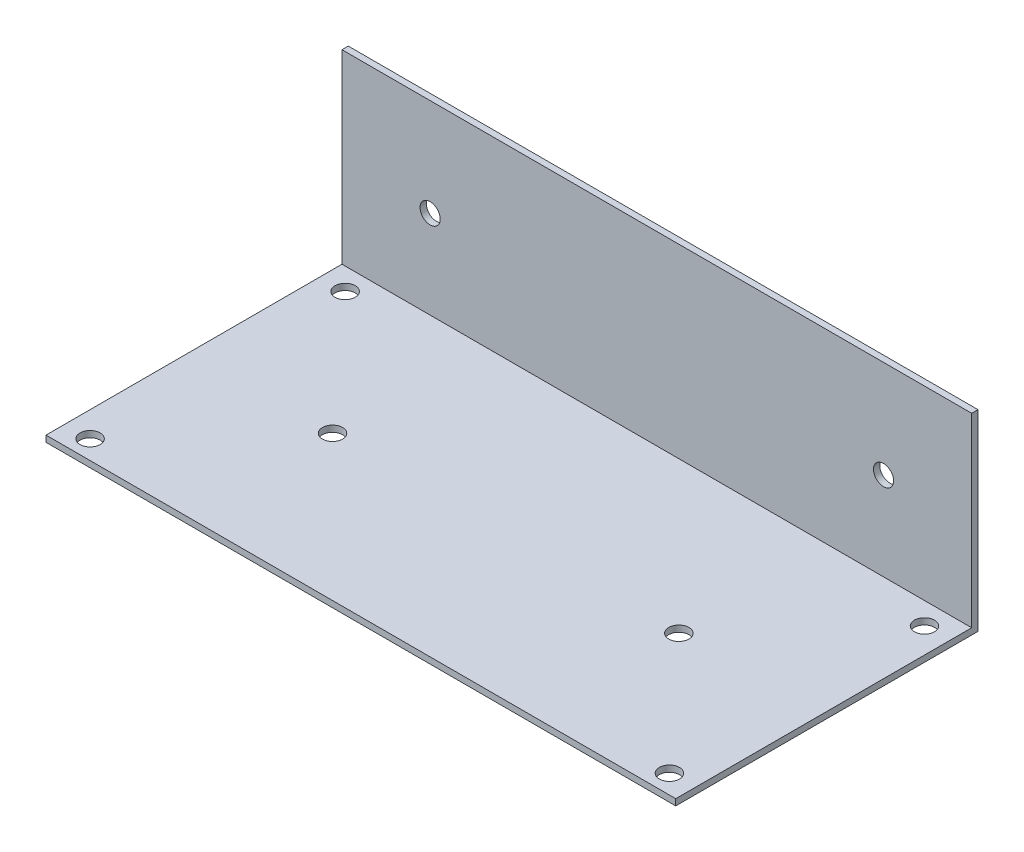
ISO-10303-21;
HEADER;
FILE_DESCRIPTION(('STEP AP214'),'2;1');
FILE_NAME('part.step','',(''),(''),'','','');
FILE_SCHEMA(('AUTOMOTIVE_DESIGN { 1 0 10303 214 1 1 1 1 }'));
ENDSEC;
DATA;
#1=APPLICATION_CONTEXT('core data for automotive mechanical design processes');
#2=APPLICATION_PROTOCOL_DEFINITION('international standard','automotive_design',2000,#1);
#3=PRODUCT_CONTEXT('',#1,'mechanical');
#4=PRODUCT('Part','Part','',(#3));
#5=PRODUCT_RELATED_PRODUCT_CATEGORY('part','',(#4));
#6=PRODUCT_DEFINITION_FORMATION('','',#4);
#7=PRODUCT_DEFINITION_CONTEXT('part definition',#1,'design');
#8=PRODUCT_DEFINITION('design','',#6,#7);
#9=PRODUCT_DEFINITION_SHAPE('','',#8);
#10=(LENGTH_UNIT() NAMED_UNIT(*) SI_UNIT(.MILLI.,.METRE.));
#11=(NAMED_UNIT(*) PLANE_ANGLE_UNIT() SI_UNIT($,.RADIAN.));
#12=(NAMED_UNIT(*) SI_UNIT($,.STERADIAN.) SOLID_ANGLE_UNIT());
#13=UNCERTAINTY_MEASURE_WITH_UNIT(LENGTH_MEASURE(1.E-05),#10,'distance_accuracy_value','');
#14=(GEOMETRIC_REPRESENTATION_CONTEXT(3) GLOBAL_UNCERTAINTY_ASSIGNED_CONTEXT((#13)) GLOBAL_UNIT_ASSIGNED_CONTEXT((#10,
#11,#12)) REPRESENTATION_CONTEXT('',''));
#15=CARTESIAN_POINT('',(0.,0.,0.));
#16=DIRECTION('',(0.,0.,1.));
#17=DIRECTION('',(1.,0.,0.));
#18=AXIS2_PLACEMENT_3D('',#15,#16,#17);
#19=CARTESIAN_POINT('',(100.,0.,0.));
#20=DIRECTION('',(0.,0.,1.));
#21=DIRECTION('',(1.,0.,0.));
#22=AXIS2_PLACEMENT_3D('',#19,#20,#21);
#23=PLANE('',#22);
#24=CARTESIAN_POINT('',(86.,15.,0.));
#25=DIRECTION('',(0.,0.,-1.));
#26=DIRECTION('',(-1.,0.,0.));
#27=AXIS2_PLACEMENT_3D('',#24,#25,#26);
#28=CIRCLE('',#27,1.6);
#29=CARTESIAN_POINT('',(84.4,15.,0.));
#30=VERTEX_POINT('',#29);
#31=EDGE_CURVE('E193',#30,#30,#28,.T.);
#32=ORIENTED_EDGE('',*,*,#31,.F.);
#33=EDGE_LOOP('',(#32));
#34=FACE_BOUND('',#33,.T.);
#35=CARTESIAN_POINT('',(14.,15.,0.));
#36=DIRECTION('',(0.,0.,-1.));
#37=DIRECTION('',(-1.,0.,0.));
#38=AXIS2_PLACEMENT_3D('',#35,#36,#37);
#39=CIRCLE('',#38,1.6);
#40=CARTESIAN_POINT('',(12.4,15.,0.));
#41=VERTEX_POINT('',#40);
#42=EDGE_CURVE('E196',#41,#41,#39,.T.);
#43=ORIENTED_EDGE('',*,*,#42,.F.);
#44=EDGE_LOOP('',(#43));
#45=FACE_BOUND('',#44,.T.);
#46=DIRECTION('',(0.,1.,0.));
#47=VECTOR('',#46,1.);
#48=CARTESIAN_POINT('',(0.,0.,0.));
#49=LINE('',#48,#47);
#50=CARTESIAN_POINT('',(0.,0.,0.));
#51=VERTEX_POINT('',#50);
#52=CARTESIAN_POINT('',(0.,30.5,0.));
#53=VERTEX_POINT('',#52);
#54=EDGE_CURVE('E133',#51,#53,#49,.T.);
#55=ORIENTED_EDGE('',*,*,#54,.T.);
#56=DIRECTION('',(-1.,0.,0.));
#57=VECTOR('',#56,1.);
#58=CARTESIAN_POINT('',(100.,30.5,0.));
#59=LINE('',#58,#57);
#60=CARTESIAN_POINT('',(100.,30.5,0.));
#61=VERTEX_POINT('',#60);
#62=EDGE_CURVE('E11',#61,#53,#59,.T.);
#63=ORIENTED_EDGE('',*,*,#62,.F.);
#64=DIRECTION('',(0.,1.,0.));
#65=VECTOR('',#64,1.);
#66=CARTESIAN_POINT('',(100.,0.,0.));
#67=LINE('',#66,#65);
#68=CARTESIAN_POINT('',(100.,0.,0.));
#69=VERTEX_POINT('',#68);
#70=EDGE_CURVE('E150',#69,#61,#67,.T.);
#71=ORIENTED_EDGE('',*,*,#70,.F.);
#72=DIRECTION('',(-1.,0.,0.));
#73=VECTOR('',#72,1.);
#74=CARTESIAN_POINT('',(100.,0.,0.));
#75=LINE('',#74,#73);
#76=EDGE_CURVE('E129',#69,#51,#75,.T.);
#77=ORIENTED_EDGE('',*,*,#76,.T.);
#78=EDGE_LOOP('',(#55,#63,#71,#77));
#79=FACE_BOUND('',#78,.T.);
#80=ADVANCED_FACE('F44',(#34,#45,#79),#23,.F.);
#81=CARTESIAN_POINT('',(100.,30.5,0.));
#82=DIRECTION('',(0.,-1.,0.));
#83=DIRECTION('',(0.,0.,-1.));
#84=AXIS2_PLACEMENT_3D('',#81,#82,#83);
#85=PLANE('',#84);
#86=DIRECTION('',(0.,0.,1.));
#87=VECTOR('',#86,1.);
#88=CARTESIAN_POINT('',(0.,30.5,0.));
#89=LINE('',#88,#87);
#90=CARTESIAN_POINT('',(0.,30.5,1.));
#91=VERTEX_POINT('',#90);
#92=EDGE_CURVE('E137',#53,#91,#89,.T.);
#93=ORIENTED_EDGE('',*,*,#92,.T.);
#94=DIRECTION('',(-1.,0.,0.));
#95=VECTOR('',#94,1.);
#96=CARTESIAN_POINT('',(100.,30.5,1.));
#97=LINE('',#96,#95);
#98=CARTESIAN_POINT('',(100.,30.5,1.));
#99=VERTEX_POINT('',#98);
#100=EDGE_CURVE('E53',#99,#91,#97,.T.);
#101=ORIENTED_EDGE('',*,*,#100,.F.);
#102=DIRECTION('',(0.,0.,1.));
#103=VECTOR('',#102,1.);
#104=CARTESIAN_POINT('',(100.,30.5,0.));
#105=LINE('',#104,#103);
#106=EDGE_CURVE('E98',#61,#99,#105,.T.);
#107=ORIENTED_EDGE('',*,*,#106,.F.);
#108=ORIENTED_EDGE('',*,*,#62,.T.);
#109=EDGE_LOOP('',(#93,#101,#107,#108));
#110=FACE_BOUND('',#109,.T.);
#111=ADVANCED_FACE('F183',(#110),#85,.F.);
#112=CARTESIAN_POINT('',(100.,30.5,1.));
#113=DIRECTION('',(0.,0.,-1.));
#114=DIRECTION('',(0.,1.,0.));
#115=AXIS2_PLACEMENT_3D('',#112,#113,#114);
#116=PLANE('',#115);
#117=CARTESIAN_POINT('',(86.,15.,0.999999999999997));
#118=DIRECTION('',(0.,0.,-1.));
#119=DIRECTION('',(0.,1.,0.));
#120=AXIS2_PLACEMENT_3D('',#117,#118,#119);
#121=CIRCLE('',#120,1.6);
#122=CARTESIAN_POINT('',(86.,16.6,0.999999999999997));
#123=VERTEX_POINT('',#122);
#124=EDGE_CURVE('E138',#123,#123,#121,.F.);
#125=ORIENTED_EDGE('',*,*,#124,.F.);
#126=EDGE_LOOP('',(#125));
#127=FACE_BOUND('',#126,.T.);
#128=CARTESIAN_POINT('',(14.,15.,0.999999999999997));
#129=DIRECTION('',(0.,0.,-1.));
#130=DIRECTION('',(0.,1.,0.));
#131=AXIS2_PLACEMENT_3D('',#128,#129,#130);
#132=CIRCLE('',#131,1.6);
#133=CARTESIAN_POINT('',(14.,16.6,0.999999999999997));
#134=VERTEX_POINT('',#133);
#135=EDGE_CURVE('E199',#134,#134,#132,.F.);
#136=ORIENTED_EDGE('',*,*,#135,.F.);
#137=EDGE_LOOP('',(#136));
#138=FACE_BOUND('',#137,.T.);
#139=DIRECTION('',(0.,-1.,0.));
#140=VECTOR('',#139,1.);
#141=CARTESIAN_POINT('',(0.,30.5,1.));
#142=LINE('',#141,#140);
#143=CARTESIAN_POINT('',(0.,0.999999999999994,0.999999999999994));
#144=VERTEX_POINT('',#143);
#145=EDGE_CURVE('E141',#91,#144,#142,.T.);
#146=ORIENTED_EDGE('',*,*,#145,.T.);
#147=DIRECTION('',(-1.,0.,0.));
#148=VECTOR('',#147,1.);
#149=CARTESIAN_POINT('',(100.,0.999999999999994,0.999999999999994));
#150=LINE('',#149,#148);
#151=CARTESIAN_POINT('',(100.,0.999999999999994,0.999999999999994));
#152=VERTEX_POINT('',#151);
#153=EDGE_CURVE('E122',#152,#144,#150,.T.);
#154=ORIENTED_EDGE('',*,*,#153,.F.);
#155=DIRECTION('',(0.,-1.,0.));
#156=VECTOR('',#155,1.);
#157=CARTESIAN_POINT('',(100.,30.5,1.));
#158=LINE('',#157,#156);
#159=EDGE_CURVE('E111',#99,#152,#158,.T.);
#160=ORIENTED_EDGE('',*,*,#159,.F.);
#161=ORIENTED_EDGE('',*,*,#100,.T.);
#162=EDGE_LOOP('',(#146,#154,#160,#161));
#163=FACE_BOUND('',#162,.T.);
#164=ADVANCED_FACE('F160',(#127,#138,#163),#116,.F.);
#165=CARTESIAN_POINT('',(100.,0.999999999999994,48.));
#166=DIRECTION('',(0.,-1.,0.));
#167=DIRECTION('',(0.,0.,-1.));
#168=AXIS2_PLACEMENT_3D('',#165,#166,#167);
#169=PLANE('',#168);
#170=CARTESIAN_POINT('',(4.00000000000042,0.999999999999994,4.5));
#171=DIRECTION('',(0.,-1.,0.));
#172=DIRECTION('',(0.,0.,-1.));
#173=AXIS2_PLACEMENT_3D('',#170,#171,#172);
#174=CIRCLE('',#173,1.6);
#175=CARTESIAN_POINT('',(4.00000000000042,0.999999999999994,2.9));
#176=VERTEX_POINT('',#175);
#177=EDGE_CURVE('E227',#176,#176,#174,.T.);
#178=ORIENTED_EDGE('',*,*,#177,.T.);
#179=EDGE_LOOP('',(#178));
#180=FACE_BOUND('',#179,.T.);
#181=CARTESIAN_POINT('',(96.0000000000004,0.999999999999994,4.5));
#182=DIRECTION('',(0.,-1.,0.));
#183=DIRECTION('',(0.,0.,-1.));
#184=AXIS2_PLACEMENT_3D('',#181,#182,#183);
#185=CIRCLE('',#184,1.60000000000001);
#186=CARTESIAN_POINT('',(96.0000000000004,0.999999999999994,2.89999999999999));
#187=VERTEX_POINT('',#186);
#188=EDGE_CURVE('E237',#187,#187,#185,.T.);
#189=ORIENTED_EDGE('',*,*,#188,.T.);
#190=EDGE_LOOP('',(#189));
#191=FACE_BOUND('',#190,.T.);
#192=CARTESIAN_POINT('',(96.,0.999999999999994,45.));
#193=DIRECTION('',(0.,-1.,0.));
#194=DIRECTION('',(0.,0.,-1.));
#195=AXIS2_PLACEMENT_3D('',#192,#193,#194);
#196=CIRCLE('',#195,1.60000000000001);
#197=CARTESIAN_POINT('',(96.,0.999999999999994,43.4));
#198=VERTEX_POINT('',#197);
#199=EDGE_CURVE('E241',#198,#198,#196,.T.);
#200=ORIENTED_EDGE('',*,*,#199,.T.);
#201=EDGE_LOOP('',(#200));
#202=FACE_BOUND('',#201,.T.);
#203=CARTESIAN_POINT('',(4.,0.999999999999994,45.));
#204=DIRECTION('',(0.,-1.,0.));
#205=DIRECTION('',(0.,0.,-1.));
#206=AXIS2_PLACEMENT_3D('',#203,#204,#205);
#207=CIRCLE('',#206,1.6);
#208=CARTESIAN_POINT('',(4.,0.999999999999994,43.4));
#209=VERTEX_POINT('',#208);
#210=EDGE_CURVE('E245',#209,#209,#207,.T.);
#211=ORIENTED_EDGE('',*,*,#210,.T.);
#212=EDGE_LOOP('',(#211));
#213=FACE_BOUND('',#212,.T.);
#214=CARTESIAN_POINT('',(22.5,0.999999999999994,25.));
#215=DIRECTION('',(0.,-1.,0.));
#216=DIRECTION('',(0.,0.,-1.));
#217=AXIS2_PLACEMENT_3D('',#214,#215,#216);
#218=CIRCLE('',#217,1.6);
#219=CARTESIAN_POINT('',(22.5,0.999999999999994,23.4));
#220=VERTEX_POINT('',#219);
#221=EDGE_CURVE('E205',#220,#220,#218,.F.);
#222=ORIENTED_EDGE('',*,*,#221,.F.);
#223=EDGE_LOOP('',(#222));
#224=FACE_BOUND('',#223,.T.);
#225=CARTESIAN_POINT('',(77.5,0.999999999999994,25.));
#226=DIRECTION('',(0.,-1.,0.));
#227=DIRECTION('',(0.,0.,-1.));
#228=AXIS2_PLACEMENT_3D('',#225,#226,#227);
#229=CIRCLE('',#228,1.6);
#230=CARTESIAN_POINT('',(77.5,0.999999999999994,23.4));
#231=VERTEX_POINT('',#230);
#232=EDGE_CURVE('E223',#231,#231,#229,.F.);
#233=ORIENTED_EDGE('',*,*,#232,.F.);
#234=EDGE_LOOP('',(#233));
#235=FACE_BOUND('',#234,.T.);
#236=DIRECTION('',(0.,0.,1.));
#237=VECTOR('',#236,1.);
#238=CARTESIAN_POINT('',(0.,0.999999999999994,48.));
#239=LINE('',#238,#237);
#240=CARTESIAN_POINT('',(0.,0.999999999999994,48.));
#241=VERTEX_POINT('',#240);
#242=EDGE_CURVE('E120',#144,#241,#239,.T.);
#243=ORIENTED_EDGE('',*,*,#242,.T.);
#244=DIRECTION('',(-1.,0.,0.));
#245=VECTOR('',#244,1.);
#246=CARTESIAN_POINT('',(100.,0.999999999999994,48.));
#247=LINE('',#246,#245);
#248=CARTESIAN_POINT('',(100.,0.999999999999994,48.));
#249=VERTEX_POINT('',#248);
#250=EDGE_CURVE('E117',#249,#241,#247,.T.);
#251=ORIENTED_EDGE('',*,*,#250,.F.);
#252=DIRECTION('',(0.,0.,1.));
#253=VECTOR('',#252,1.);
#254=CARTESIAN_POINT('',(100.,0.999999999999994,48.));
#255=LINE('',#254,#253);
#256=EDGE_CURVE('E105',#152,#249,#255,.T.);
#257=ORIENTED_EDGE('',*,*,#256,.F.);
#258=ORIENTED_EDGE('',*,*,#153,.T.);
#259=EDGE_LOOP('',(#243,#251,#257,#258));
#260=FACE_BOUND('',#259,.T.);
#261=ADVANCED_FACE('F118',(#180,#191,#202,#213,#224,#235,#260),#169,.F.);
#262=CARTESIAN_POINT('',(100.,0.,48.));
#263=DIRECTION('',(0.,0.,-1.));
#264=DIRECTION('',(0.,1.,0.));
#265=AXIS2_PLACEMENT_3D('',#262,#263,#264);
#266=PLANE('',#265);
#267=DIRECTION('',(0.,-1.,0.));
#268=VECTOR('',#267,1.);
#269=CARTESIAN_POINT('',(0.,0.,48.));
#270=LINE('',#269,#268);
#271=CARTESIAN_POINT('',(0.,0.,48.));
#272=VERTEX_POINT('',#271);
#273=EDGE_CURVE('E84',#241,#272,#270,.T.);
#274=ORIENTED_EDGE('',*,*,#273,.T.);
#275=DIRECTION('',(-1.,0.,0.));
#276=VECTOR('',#275,1.);
#277=CARTESIAN_POINT('',(100.,0.,48.));
#278=LINE('',#277,#276);
#279=CARTESIAN_POINT('',(100.,0.,48.));
#280=VERTEX_POINT('',#279);
#281=EDGE_CURVE('E123',#280,#272,#278,.T.);
#282=ORIENTED_EDGE('',*,*,#281,.F.);
#283=DIRECTION('',(0.,-1.,0.));
#284=VECTOR('',#283,1.);
#285=CARTESIAN_POINT('',(100.,0.,48.));
#286=LINE('',#285,#284);
#287=EDGE_CURVE('E109',#249,#280,#286,.T.);
#288=ORIENTED_EDGE('',*,*,#287,.F.);
#289=ORIENTED_EDGE('',*,*,#250,.T.);
#290=EDGE_LOOP('',(#274,#282,#288,#289));
#291=FACE_BOUND('',#290,.T.);
#292=ADVANCED_FACE('F125',(#291),#266,.F.);
#293=CARTESIAN_POINT('',(100.,0.,0.));
#294=DIRECTION('',(0.,1.,0.));
#295=DIRECTION('',(0.,0.,1.));
#296=AXIS2_PLACEMENT_3D('',#293,#294,#295);
#297=PLANE('',#296);
#298=CARTESIAN_POINT('',(4.00000000000042,0.,4.5));
#299=DIRECTION('',(0.,-1.,0.));
#300=DIRECTION('',(0.,0.,-1.));
#301=AXIS2_PLACEMENT_3D('',#298,#299,#300);
#302=CIRCLE('',#301,1.6);
#303=CARTESIAN_POINT('',(4.00000000000042,0.,2.9));
#304=VERTEX_POINT('',#303);
#305=EDGE_CURVE('E254',#304,#304,#302,.T.);
#306=ORIENTED_EDGE('',*,*,#305,.F.);
#307=EDGE_LOOP('',(#306));
#308=FACE_BOUND('',#307,.T.);
#309=CARTESIAN_POINT('',(96.0000000000004,0.,4.5));
#310=DIRECTION('',(0.,-1.,0.));
#311=DIRECTION('',(0.,0.,-1.));
#312=AXIS2_PLACEMENT_3D('',#309,#310,#311);
#313=CIRCLE('',#312,1.60000000000001);
#314=CARTESIAN_POINT('',(96.0000000000004,0.,2.89999999999999));
#315=VERTEX_POINT('',#314);
#316=EDGE_CURVE('E258',#315,#315,#313,.T.);
#317=ORIENTED_EDGE('',*,*,#316,.F.);
#318=EDGE_LOOP('',(#317));
#319=FACE_BOUND('',#318,.T.);
#320=CARTESIAN_POINT('',(96.,0.,45.));
#321=DIRECTION('',(0.,-1.,0.));
#322=DIRECTION('',(0.,0.,-1.));
#323=AXIS2_PLACEMENT_3D('',#320,#321,#322);
#324=CIRCLE('',#323,1.60000000000001);
#325=CARTESIAN_POINT('',(96.,0.,43.4));
#326=VERTEX_POINT('',#325);
#327=EDGE_CURVE('E253',#326,#326,#324,.T.);
#328=ORIENTED_EDGE('',*,*,#327,.F.);
#329=EDGE_LOOP('',(#328));
#330=FACE_BOUND('',#329,.T.);
#331=CARTESIAN_POINT('',(4.,0.,45.));
#332=DIRECTION('',(0.,-1.,0.));
#333=DIRECTION('',(0.,0.,-1.));
#334=AXIS2_PLACEMENT_3D('',#331,#332,#333);
#335=CIRCLE('',#334,1.6);
#336=CARTESIAN_POINT('',(4.,0.,43.4));
#337=VERTEX_POINT('',#336);
#338=EDGE_CURVE('E249',#337,#337,#335,.T.);
#339=ORIENTED_EDGE('',*,*,#338,.F.);
#340=EDGE_LOOP('',(#339));
#341=FACE_BOUND('',#340,.T.);
#342=CARTESIAN_POINT('',(22.5,0.,25.));
#343=DIRECTION('',(0.,-1.,0.));
#344=DIRECTION('',(0.,0.,-1.));
#345=AXIS2_PLACEMENT_3D('',#342,#343,#344);
#346=CIRCLE('',#345,1.6);
#347=CARTESIAN_POINT('',(22.5,0.,23.4));
#348=VERTEX_POINT('',#347);
#349=EDGE_CURVE('E222',#348,#348,#346,.T.);
#350=ORIENTED_EDGE('',*,*,#349,.F.);
#351=EDGE_LOOP('',(#350));
#352=FACE_BOUND('',#351,.T.);
#353=CARTESIAN_POINT('',(77.5,0.,25.));
#354=DIRECTION('',(0.,-1.,0.));
#355=DIRECTION('',(0.,0.,-1.));
#356=AXIS2_PLACEMENT_3D('',#353,#354,#355);
#357=CIRCLE('',#356,1.6);
#358=CARTESIAN_POINT('',(77.5,0.,23.4));
#359=VERTEX_POINT('',#358);
#360=EDGE_CURVE('E218',#359,#359,#357,.T.);
#361=ORIENTED_EDGE('',*,*,#360,.F.);
#362=EDGE_LOOP('',(#361));
#363=FACE_BOUND('',#362,.T.);
#364=DIRECTION('',(0.,0.,-1.));
#365=VECTOR('',#364,1.);
#366=CARTESIAN_POINT('',(0.,0.,0.));
#367=LINE('',#366,#365);
#368=EDGE_CURVE('E90',#272,#51,#367,.T.);
#369=ORIENTED_EDGE('',*,*,#368,.T.);
#370=ORIENTED_EDGE('',*,*,#76,.F.);
#371=DIRECTION('',(0.,0.,-1.));
#372=VECTOR('',#371,1.);
#373=CARTESIAN_POINT('',(100.,0.,0.));
#374=LINE('',#373,#372);
#375=EDGE_CURVE('E61',#280,#69,#374,.T.);
#376=ORIENTED_EDGE('',*,*,#375,.F.);
#377=ORIENTED_EDGE('',*,*,#281,.T.);
#378=EDGE_LOOP('',(#369,#370,#376,#377));
#379=FACE_BOUND('',#378,.T.);
#380=ADVANCED_FACE('F167',(#308,#319,#330,#341,#352,#363,#379),#297,.F.);
#381=CARTESIAN_POINT('',(100.,0.,0.));
#382=DIRECTION('',(1.,0.,0.));
#383=DIRECTION('',(0.,0.,-1.));
#384=AXIS2_PLACEMENT_3D('',#381,#382,#383);
#385=PLANE('',#384);
#386=ORIENTED_EDGE('',*,*,#70,.T.);
#387=ORIENTED_EDGE('',*,*,#106,.T.);
#388=ORIENTED_EDGE('',*,*,#159,.T.);
#389=ORIENTED_EDGE('',*,*,#256,.T.);
#390=ORIENTED_EDGE('',*,*,#287,.T.);
#391=ORIENTED_EDGE('',*,*,#375,.T.);
#392=EDGE_LOOP('',(#386,#387,#388,#389,#390,#391));
#393=FACE_BOUND('',#392,.T.);
#394=ADVANCED_FACE('F107',(#393),#385,.T.);
#395=CARTESIAN_POINT('',(0.,0.,0.));
#396=DIRECTION('',(1.,0.,0.));
#397=DIRECTION('',(0.,0.,-1.));
#398=AXIS2_PLACEMENT_3D('',#395,#396,#397);
#399=PLANE('',#398);
#400=ORIENTED_EDGE('',*,*,#54,.F.);
#401=ORIENTED_EDGE('',*,*,#368,.F.);
#402=ORIENTED_EDGE('',*,*,#273,.F.);
#403=ORIENTED_EDGE('',*,*,#242,.F.);
#404=ORIENTED_EDGE('',*,*,#145,.F.);
#405=ORIENTED_EDGE('',*,*,#92,.F.);
#406=EDGE_LOOP('',(#400,#401,#402,#403,#404,#405));
#407=FACE_BOUND('',#406,.T.);
#408=ADVANCED_FACE('F163',(#407),#399,.F.);
#409=CARTESIAN_POINT('',(14.,15.,5.52548339959391));
#410=DIRECTION('',(0.,0.,-1.));
#411=DIRECTION('',(-1.,0.,0.));
#412=AXIS2_PLACEMENT_3D('',#409,#410,#411);
#413=CYLINDRICAL_SURFACE('',#412,1.6);
#414=ORIENTED_EDGE('',*,*,#135,.T.);
#415=EDGE_LOOP('',(#414));
#416=FACE_BOUND('',#415,.T.);
#417=ORIENTED_EDGE('',*,*,#42,.T.);
#418=EDGE_LOOP('',(#417));
#419=FACE_BOUND('',#418,.T.);
#420=ADVANCED_FACE('F289',(#416,#419),#413,.F.);
#421=CARTESIAN_POINT('',(86.,15.,5.52548339959391));
#422=DIRECTION('',(0.,0.,-1.));
#423=DIRECTION('',(-1.,0.,0.));
#424=AXIS2_PLACEMENT_3D('',#421,#422,#423);
#425=CYLINDRICAL_SURFACE('',#424,1.6);
#426=ORIENTED_EDGE('',*,*,#124,.T.);
#427=EDGE_LOOP('',(#426));
#428=FACE_BOUND('',#427,.T.);
#429=ORIENTED_EDGE('',*,*,#31,.T.);
#430=EDGE_LOOP('',(#429));
#431=FACE_BOUND('',#430,.T.);
#432=ADVANCED_FACE('F279',(#428,#431),#425,.F.);
#433=CARTESIAN_POINT('',(77.5,5.52548339959391,25.));
#434=DIRECTION('',(0.,-1.,0.));
#435=DIRECTION('',(0.,0.,-1.));
#436=AXIS2_PLACEMENT_3D('',#433,#434,#435);
#437=CYLINDRICAL_SURFACE('',#436,1.6);
#438=ORIENTED_EDGE('',*,*,#232,.T.);
#439=EDGE_LOOP('',(#438));
#440=FACE_BOUND('',#439,.T.);
#441=ORIENTED_EDGE('',*,*,#360,.T.);
#442=EDGE_LOOP('',(#441));
#443=FACE_BOUND('',#442,.T.);
#444=ADVANCED_FACE('F276',(#440,#443),#437,.F.);
#445=CARTESIAN_POINT('',(22.5,5.52548339959391,25.));
#446=DIRECTION('',(0.,-1.,0.));
#447=DIRECTION('',(0.,0.,-1.));
#448=AXIS2_PLACEMENT_3D('',#445,#446,#447);
#449=CYLINDRICAL_SURFACE('',#448,1.6);
#450=ORIENTED_EDGE('',*,*,#221,.T.);
#451=EDGE_LOOP('',(#450));
#452=FACE_BOUND('',#451,.T.);
#453=ORIENTED_EDGE('',*,*,#349,.T.);
#454=EDGE_LOOP('',(#453));
#455=FACE_BOUND('',#454,.T.);
#456=ADVANCED_FACE('F278',(#452,#455),#449,.F.);
#457=CARTESIAN_POINT('',(4.,10.,45.));
#458=DIRECTION('',(0.,-1.,0.));
#459=DIRECTION('',(0.,0.,-1.));
#460=AXIS2_PLACEMENT_3D('',#457,#458,#459);
#461=CYLINDRICAL_SURFACE('',#460,1.6);
#462=ORIENTED_EDGE('',*,*,#338,.T.);
#463=EDGE_LOOP('',(#462));
#464=FACE_BOUND('',#463,.T.);
#465=ORIENTED_EDGE('',*,*,#210,.F.);
#466=EDGE_LOOP('',(#465));
#467=FACE_BOUND('',#466,.T.);
#468=ADVANCED_FACE('F286',(#464,#467),#461,.F.);
#469=CARTESIAN_POINT('',(96.,10.,45.));
#470=DIRECTION('',(0.,-1.,0.));
#471=DIRECTION('',(0.,0.,-1.));
#472=AXIS2_PLACEMENT_3D('',#469,#470,#471);
#473=CYLINDRICAL_SURFACE('',#472,1.60000000000001);
#474=ORIENTED_EDGE('',*,*,#327,.T.);
#475=EDGE_LOOP('',(#474));
#476=FACE_BOUND('',#475,.T.);
#477=ORIENTED_EDGE('',*,*,#199,.F.);
#478=EDGE_LOOP('',(#477));
#479=FACE_BOUND('',#478,.T.);
#480=ADVANCED_FACE('F266',(#476,#479),#473,.F.);
#481=CARTESIAN_POINT('',(96.0000000000004,10.,4.5));
#482=DIRECTION('',(0.,-1.,0.));
#483=DIRECTION('',(0.,0.,-1.));
#484=AXIS2_PLACEMENT_3D('',#481,#482,#483);
#485=CYLINDRICAL_SURFACE('',#484,1.60000000000001);
#486=ORIENTED_EDGE('',*,*,#316,.T.);
#487=EDGE_LOOP('',(#486));
#488=FACE_BOUND('',#487,.T.);
#489=ORIENTED_EDGE('',*,*,#188,.F.);
#490=EDGE_LOOP('',(#489));
#491=FACE_BOUND('',#490,.T.);
#492=ADVANCED_FACE('F359',(#488,#491),#485,.F.);
#493=CARTESIAN_POINT('',(4.00000000000042,10.,4.5));
#494=DIRECTION('',(0.,-1.,0.));
#495=DIRECTION('',(0.,0.,-1.));
#496=AXIS2_PLACEMENT_3D('',#493,#494,#495);
#497=CYLINDRICAL_SURFACE('',#496,1.6);
#498=ORIENTED_EDGE('',*,*,#305,.T.);
#499=EDGE_LOOP('',(#498));
#500=FACE_BOUND('',#499,.T.);
#501=ORIENTED_EDGE('',*,*,#177,.F.);
#502=EDGE_LOOP('',(#501));
#503=FACE_BOUND('',#502,.T.);
#504=ADVANCED_FACE('F368',(#500,#503),#497,.F.);
#505=CLOSED_SHELL('',(#80,#111,#164,#261,#292,#380,#394,#408,#420,#432,#444,#456,#468,#480,#492,#504));
#506=MANIFOLD_SOLID_BREP('B2',#505);
#507=ADVANCED_BREP_SHAPE_REPRESENTATION('',(#18,#506),#14);
#508=SHAPE_DEFINITION_REPRESENTATION(#9,#507);
ENDSEC;
END-ISO-10303-21;
